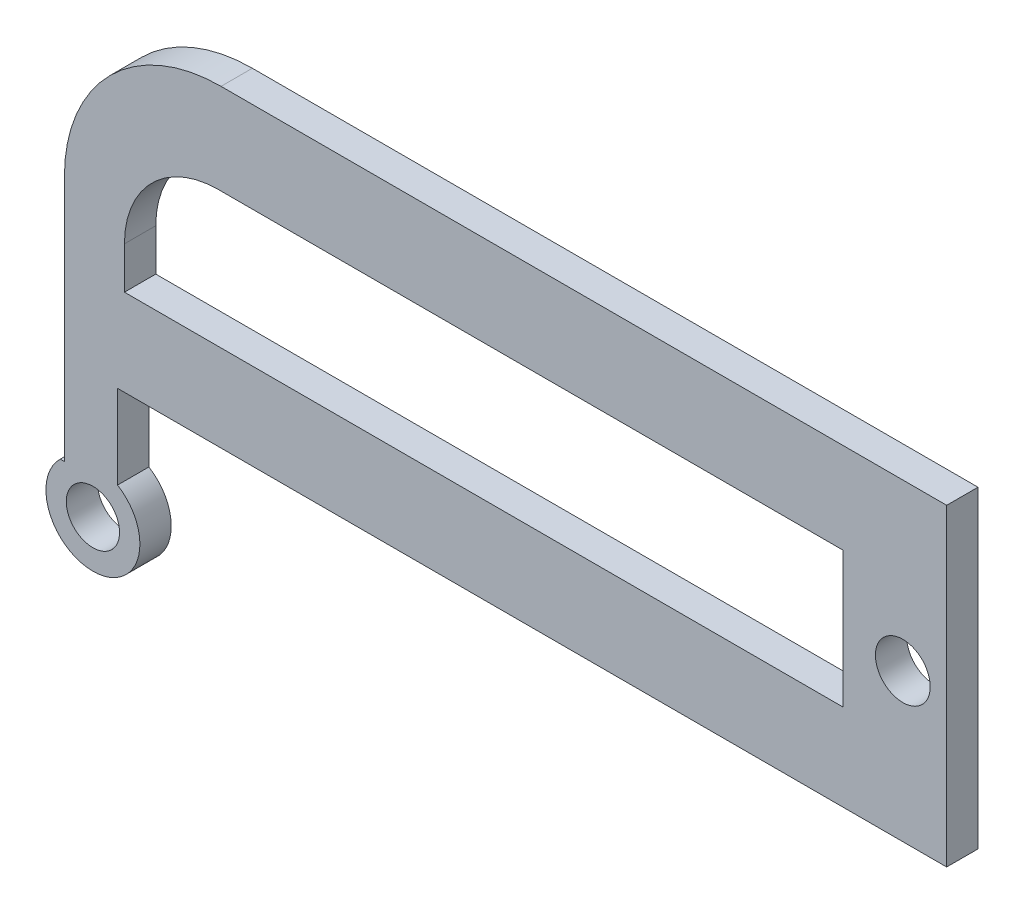
ISO-10303-21;
HEADER;
FILE_DESCRIPTION(('STEP AP214'),'2;1');
FILE_NAME('part.step','',(''),(''),'','','');
FILE_SCHEMA(('AUTOMOTIVE_DESIGN { 1 0 10303 214 1 1 1 1 }'));
ENDSEC;
DATA;
#1=APPLICATION_CONTEXT('core data for automotive mechanical design processes');
#2=APPLICATION_PROTOCOL_DEFINITION('international standard','automotive_design',2000,#1);
#3=PRODUCT_CONTEXT('',#1,'mechanical');
#4=PRODUCT('Part','Part','',(#3));
#5=PRODUCT_RELATED_PRODUCT_CATEGORY('part','',(#4));
#6=PRODUCT_DEFINITION_FORMATION('','',#4);
#7=PRODUCT_DEFINITION_CONTEXT('part definition',#1,'design');
#8=PRODUCT_DEFINITION('design','',#6,#7);
#9=PRODUCT_DEFINITION_SHAPE('','',#8);
#10=(LENGTH_UNIT() NAMED_UNIT(*) SI_UNIT(.MILLI.,.METRE.));
#11=(NAMED_UNIT(*) PLANE_ANGLE_UNIT() SI_UNIT($,.RADIAN.));
#12=(NAMED_UNIT(*) SI_UNIT($,.STERADIAN.) SOLID_ANGLE_UNIT());
#13=UNCERTAINTY_MEASURE_WITH_UNIT(LENGTH_MEASURE(1.E-05),#10,'distance_accuracy_value','');
#14=(GEOMETRIC_REPRESENTATION_CONTEXT(3) GLOBAL_UNCERTAINTY_ASSIGNED_CONTEXT((#13)) GLOBAL_UNIT_ASSIGNED_CONTEXT((#10,
#11,#12)) REPRESENTATION_CONTEXT('',''));
#15=CARTESIAN_POINT('',(0.,0.,0.));
#16=DIRECTION('',(0.,0.,1.));
#17=DIRECTION('',(1.,0.,0.));
#18=AXIS2_PLACEMENT_3D('',#15,#16,#17);
#19=CARTESIAN_POINT('',(0.,-12.4867305672765,2.));
#20=DIRECTION('',(0.,-1.,0.));
#21=DIRECTION('',(0.,0.,-1.));
#22=AXIS2_PLACEMENT_3D('',#19,#20,#21);
#23=PLANE('',#22);
#24=DIRECTION('',(-1.,0.,0.));
#25=VECTOR('',#24,1.);
#26=CARTESIAN_POINT('',(0.,-12.4867305672765,0.));
#27=LINE('',#26,#25);
#28=CARTESIAN_POINT('',(-27.6972768172026,-12.4867305672765,0.));
#29=VERTEX_POINT('',#28);
#30=CARTESIAN_POINT('',(-27.9606582372552,-12.4867305672765,0.));
#31=VERTEX_POINT('',#30);
#32=EDGE_CURVE('E195',#29,#31,#27,.T.);
#33=ORIENTED_EDGE('',*,*,#32,.T.);
#34=DIRECTION('',(0.,0.,-1.));
#35=VECTOR('',#34,1.);
#36=CARTESIAN_POINT('',(-27.9606582372552,-12.4867305672765,2.));
#37=LINE('',#36,#35);
#38=CARTESIAN_POINT('',(-27.9606582372552,-12.4867305672765,2.));
#39=VERTEX_POINT('',#38);
#40=EDGE_CURVE('E224',#39,#31,#37,.T.);
#41=ORIENTED_EDGE('',*,*,#40,.F.);
#42=DIRECTION('',(-1.,0.,0.));
#43=VECTOR('',#42,1.);
#44=CARTESIAN_POINT('',(0.,-12.4867305672765,2.));
#45=LINE('',#44,#43);
#46=CARTESIAN_POINT('',(-27.6972768172026,-12.4867305672765,2.));
#47=VERTEX_POINT('',#46);
#48=EDGE_CURVE('E172',#47,#39,#45,.T.);
#49=ORIENTED_EDGE('',*,*,#48,.F.);
#50=DIRECTION('',(0.,0.,-1.));
#51=VECTOR('',#50,1.);
#52=CARTESIAN_POINT('',(-27.6972768172026,-12.4867305672765,2.));
#53=LINE('',#52,#51);
#54=EDGE_CURVE('E189',#47,#29,#53,.T.);
#55=ORIENTED_EDGE('',*,*,#54,.T.);
#56=EDGE_LOOP('',(#33,#41,#49,#55));
#57=FACE_BOUND('',#56,.T.);
#58=ADVANCED_FACE('F35',(#57),#23,.F.);
#59=CARTESIAN_POINT('',(-25.8759774251106,-14.6440682579213,2.));
#60=DIRECTION('',(0.,0.,-1.));
#61=DIRECTION('',(-1.,0.,0.));
#62=AXIS2_PLACEMENT_3D('',#59,#60,#61);
#63=CYLINDRICAL_SURFACE('',#62,3.);
#64=CARTESIAN_POINT('',(-25.8759774251106,-14.6440682579213,0.));
#65=DIRECTION('',(0.,0.,1.));
#66=DIRECTION('',(1.,0.,0.));
#67=AXIS2_PLACEMENT_3D('',#64,#65,#66);
#68=CIRCLE('',#67,3.);
#69=CARTESIAN_POINT('',(-24.3013991517807,-12.0905014855111,0.));
#70=VERTEX_POINT('',#69);
#71=EDGE_CURVE('E198',#31,#70,#68,.T.);
#72=ORIENTED_EDGE('',*,*,#71,.T.);
#73=DIRECTION('',(0.,0.,-1.));
#74=VECTOR('',#73,1.);
#75=CARTESIAN_POINT('',(-24.3013991517807,-12.0905014855111,2.));
#76=LINE('',#75,#74);
#77=CARTESIAN_POINT('',(-24.3013991517807,-12.0905014855111,2.));
#78=VERTEX_POINT('',#77);
#79=EDGE_CURVE('E222',#78,#70,#76,.T.);
#80=ORIENTED_EDGE('',*,*,#79,.F.);
#81=CARTESIAN_POINT('',(-25.8759774251106,-14.6440682579213,2.));
#82=DIRECTION('',(0.,0.,1.));
#83=DIRECTION('',(1.,0.,0.));
#84=AXIS2_PLACEMENT_3D('',#81,#82,#83);
#85=CIRCLE('',#84,3.);
#86=EDGE_CURVE('E175',#39,#78,#85,.T.);
#87=ORIENTED_EDGE('',*,*,#86,.F.);
#88=ORIENTED_EDGE('',*,*,#40,.T.);
#89=EDGE_LOOP('',(#72,#80,#87,#88));
#90=FACE_BOUND('',#89,.T.);
#91=ADVANCED_FACE('F263',(#90),#63,.T.);
#92=CARTESIAN_POINT('',(-24.3013991517807,0.,2.));
#93=DIRECTION('',(1.,0.,0.));
#94=DIRECTION('',(0.,0.,-1.));
#95=AXIS2_PLACEMENT_3D('',#92,#93,#94);
#96=PLANE('',#95);
#97=DIRECTION('',(0.,-1.,0.));
#98=VECTOR('',#97,1.);
#99=CARTESIAN_POINT('',(-24.3013991517807,0.,0.));
#100=LINE('',#99,#98);
#101=CARTESIAN_POINT('',(-24.3013991517807,-6.74257553243988,0.));
#102=VERTEX_POINT('',#101);
#103=EDGE_CURVE('E201',#102,#70,#100,.T.);
#104=ORIENTED_EDGE('',*,*,#103,.F.);
#105=DIRECTION('',(0.,0.,-1.));
#106=VECTOR('',#105,1.);
#107=CARTESIAN_POINT('',(-24.3013991517807,-6.74257553243988,2.));
#108=LINE('',#107,#106);
#109=CARTESIAN_POINT('',(-24.3013991517807,-6.74257553243988,2.));
#110=VERTEX_POINT('',#109);
#111=EDGE_CURVE('E220',#110,#102,#108,.T.);
#112=ORIENTED_EDGE('',*,*,#111,.F.);
#113=DIRECTION('',(0.,-1.,0.));
#114=VECTOR('',#113,1.);
#115=CARTESIAN_POINT('',(-24.3013991517807,0.,2.));
#116=LINE('',#115,#114);
#117=EDGE_CURVE('E177',#110,#78,#116,.T.);
#118=ORIENTED_EDGE('',*,*,#117,.T.);
#119=ORIENTED_EDGE('',*,*,#79,.T.);
#120=EDGE_LOOP('',(#104,#112,#118,#119));
#121=FACE_BOUND('',#120,.T.);
#122=ADVANCED_FACE('F269',(#121),#96,.T.);
#123=CARTESIAN_POINT('',(0.,-6.74257553243988,2.));
#124=DIRECTION('',(0.,1.,0.));
#125=DIRECTION('',(0.,0.,1.));
#126=AXIS2_PLACEMENT_3D('',#123,#124,#125);
#127=PLANE('',#126);
#128=DIRECTION('',(1.,0.,0.));
#129=VECTOR('',#128,1.);
#130=CARTESIAN_POINT('',(0.,-6.74257553243988,0.));
#131=LINE('',#130,#129);
#132=CARTESIAN_POINT('',(28.6305684372034,-6.74257553243995,0.));
#133=VERTEX_POINT('',#132);
#134=EDGE_CURVE('E204',#102,#133,#131,.T.);
#135=ORIENTED_EDGE('',*,*,#134,.T.);
#136=DIRECTION('',(0.,0.,-1.));
#137=VECTOR('',#136,1.);
#138=CARTESIAN_POINT('',(28.6305684372034,-6.74257553243995,2.));
#139=LINE('',#138,#137);
#140=CARTESIAN_POINT('',(28.6305684372034,-6.74257553243995,2.));
#141=VERTEX_POINT('',#140);
#142=EDGE_CURVE('E217',#141,#133,#139,.T.);
#143=ORIENTED_EDGE('',*,*,#142,.F.);
#144=DIRECTION('',(1.,0.,0.));
#145=VECTOR('',#144,1.);
#146=CARTESIAN_POINT('',(0.,-6.74257553243988,2.));
#147=LINE('',#146,#145);
#148=EDGE_CURVE('E180',#110,#141,#147,.T.);
#149=ORIENTED_EDGE('',*,*,#148,.F.);
#150=ORIENTED_EDGE('',*,*,#111,.T.);
#151=EDGE_LOOP('',(#135,#143,#149,#150));
#152=FACE_BOUND('',#151,.T.);
#153=ADVANCED_FACE('F321',(#152),#127,.F.);
#154=CARTESIAN_POINT('',(28.6305684372034,0.,2.));
#155=DIRECTION('',(-1.,0.,0.));
#156=DIRECTION('',(0.,0.,1.));
#157=AXIS2_PLACEMENT_3D('',#154,#155,#156);
#158=PLANE('',#157);
#159=DIRECTION('',(0.,1.,0.));
#160=VECTOR('',#159,1.);
#161=CARTESIAN_POINT('',(28.6305684372034,0.,0.));
#162=LINE('',#161,#160);
#163=CARTESIAN_POINT('',(28.6305684372034,13.2574244675601,0.));
#164=VERTEX_POINT('',#163);
#165=EDGE_CURVE('E206',#133,#164,#162,.T.);
#166=ORIENTED_EDGE('',*,*,#165,.T.);
#167=DIRECTION('',(0.,0.,-1.));
#168=VECTOR('',#167,1.);
#169=CARTESIAN_POINT('',(28.6305684372034,13.2574244675601,2.));
#170=LINE('',#169,#168);
#171=CARTESIAN_POINT('',(28.6305684372034,13.2574244675601,2.));
#172=VERTEX_POINT('',#171);
#173=EDGE_CURVE('E214',#172,#164,#170,.T.);
#174=ORIENTED_EDGE('',*,*,#173,.F.);
#175=DIRECTION('',(0.,1.,0.));
#176=VECTOR('',#175,1.);
#177=CARTESIAN_POINT('',(28.6305684372034,0.,2.));
#178=LINE('',#177,#176);
#179=EDGE_CURVE('E182',#141,#172,#178,.T.);
#180=ORIENTED_EDGE('',*,*,#179,.F.);
#181=ORIENTED_EDGE('',*,*,#142,.T.);
#182=EDGE_LOOP('',(#166,#174,#180,#181));
#183=FACE_BOUND('',#182,.T.);
#184=ADVANCED_FACE('F315',(#183),#158,.F.);
#185=CARTESIAN_POINT('',(0.,13.2574244675601,2.));
#186=DIRECTION('',(0.,1.,0.));
#187=DIRECTION('',(0.,0.,1.));
#188=AXIS2_PLACEMENT_3D('',#185,#186,#187);
#189=PLANE('',#188);
#190=DIRECTION('',(1.,0.,0.));
#191=VECTOR('',#190,1.);
#192=CARTESIAN_POINT('',(0.,13.2574244675601,0.));
#193=LINE('',#192,#191);
#194=CARTESIAN_POINT('',(-17.6972768172026,13.2574244675601,0.));
#195=VERTEX_POINT('',#194);
#196=EDGE_CURVE('E209',#195,#164,#193,.T.);
#197=ORIENTED_EDGE('',*,*,#196,.F.);
#198=DIRECTION('',(0.,0.,-1.));
#199=VECTOR('',#198,1.);
#200=CARTESIAN_POINT('',(-17.6972768172026,13.2574244675601,2.));
#201=LINE('',#200,#199);
#202=CARTESIAN_POINT('',(-17.6972768172026,13.2574244675601,2.));
#203=VERTEX_POINT('',#202);
#204=EDGE_CURVE('E232',#195,#203,#201,.F.);
#205=ORIENTED_EDGE('',*,*,#204,.T.);
#206=DIRECTION('',(1.,0.,0.));
#207=VECTOR('',#206,1.);
#208=CARTESIAN_POINT('',(0.,13.2574244675601,2.));
#209=LINE('',#208,#207);
#210=EDGE_CURVE('E185',#203,#172,#209,.T.);
#211=ORIENTED_EDGE('',*,*,#210,.T.);
#212=ORIENTED_EDGE('',*,*,#173,.T.);
#213=EDGE_LOOP('',(#197,#205,#211,#212));
#214=FACE_BOUND('',#213,.T.);
#215=ADVANCED_FACE('F277',(#214),#189,.T.);
#216=CARTESIAN_POINT('',(-25.8759774251106,-14.6440682579213,2.));
#217=DIRECTION('',(0.,0.,-1.));
#218=DIRECTION('',(-1.,0.,0.));
#219=AXIS2_PLACEMENT_3D('',#216,#217,#218);
#220=CYLINDRICAL_SURFACE('',#219,1.7);
#221=CARTESIAN_POINT('',(-25.8759774251106,-14.6440682579213,2.));
#222=DIRECTION('',(0.,0.,1.));
#223=DIRECTION('',(1.,0.,0.));
#224=AXIS2_PLACEMENT_3D('',#221,#222,#223);
#225=CIRCLE('',#224,1.7);
#226=CARTESIAN_POINT('',(-24.1759774251106,-14.6440682579213,2.));
#227=VERTEX_POINT('',#226);
#228=EDGE_CURVE('E168',#227,#227,#225,.T.);
#229=ORIENTED_EDGE('',*,*,#228,.T.);
#230=EDGE_LOOP('',(#229));
#231=FACE_BOUND('',#230,.T.);
#232=CARTESIAN_POINT('',(-25.8759774251106,-14.6440682579213,0.));
#233=DIRECTION('',(0.,0.,1.));
#234=DIRECTION('',(1.,0.,0.));
#235=AXIS2_PLACEMENT_3D('',#232,#233,#234);
#236=CIRCLE('',#235,1.7);
#237=CARTESIAN_POINT('',(-24.1759774251106,-14.6440682579213,0.));
#238=VERTEX_POINT('',#237);
#239=EDGE_CURVE('E192',#238,#238,#236,.T.);
#240=ORIENTED_EDGE('',*,*,#239,.F.);
#241=EDGE_LOOP('',(#240));
#242=FACE_BOUND('',#241,.T.);
#243=ADVANCED_FACE('F274',(#231,#242),#220,.F.);
#244=CARTESIAN_POINT('',(25.8307602946802,2.70027197163987,2.));
#245=DIRECTION('',(0.,0.,-1.));
#246=DIRECTION('',(-1.,0.,0.));
#247=AXIS2_PLACEMENT_3D('',#244,#245,#246);
#248=CYLINDRICAL_SURFACE('',#247,1.75);
#249=CARTESIAN_POINT('',(25.8307602946802,2.70027197163987,2.));
#250=DIRECTION('',(0.,0.,1.));
#251=DIRECTION('',(1.,0.,0.));
#252=AXIS2_PLACEMENT_3D('',#249,#250,#251);
#253=CIRCLE('',#252,1.75);
#254=CARTESIAN_POINT('',(27.5807602946802,2.70027197163987,2.));
#255=VERTEX_POINT('',#254);
#256=EDGE_CURVE('E165',#255,#255,#253,.T.);
#257=ORIENTED_EDGE('',*,*,#256,.T.);
#258=EDGE_LOOP('',(#257));
#259=FACE_BOUND('',#258,.T.);
#260=CARTESIAN_POINT('',(25.8307602946802,2.70027197163987,0.));
#261=DIRECTION('',(0.,0.,1.));
#262=DIRECTION('',(1.,0.,0.));
#263=AXIS2_PLACEMENT_3D('',#260,#261,#262);
#264=CIRCLE('',#263,1.75);
#265=CARTESIAN_POINT('',(27.5807602946802,2.70027197163987,0.));
#266=VERTEX_POINT('',#265);
#267=EDGE_CURVE('E160',#266,#266,#264,.T.);
#268=ORIENTED_EDGE('',*,*,#267,.F.);
#269=EDGE_LOOP('',(#268));
#270=FACE_BOUND('',#269,.T.);
#271=ADVANCED_FACE('F276',(#259,#270),#248,.F.);
#272=CARTESIAN_POINT('',(-27.6972768172026,0.,2.));
#273=DIRECTION('',(1.,0.,0.));
#274=DIRECTION('',(0.,1.,0.));
#275=AXIS2_PLACEMENT_3D('',#272,#273,#274);
#276=PLANE('',#275);
#277=DIRECTION('',(0.,-1.,0.));
#278=VECTOR('',#277,1.);
#279=CARTESIAN_POINT('',(-27.6972768172026,0.,2.));
#280=LINE('',#279,#278);
#281=CARTESIAN_POINT('',(-27.6972768172026,3.25742446756005,2.));
#282=VERTEX_POINT('',#281);
#283=EDGE_CURVE('E187',#282,#47,#280,.T.);
#284=ORIENTED_EDGE('',*,*,#283,.F.);
#285=DIRECTION('',(0.,0.,-1.));
#286=VECTOR('',#285,1.);
#287=CARTESIAN_POINT('',(-27.6972768172026,3.25742446756005,0.));
#288=LINE('',#287,#286);
#289=CARTESIAN_POINT('',(-27.6972768172026,3.25742446756005,0.));
#290=VERTEX_POINT('',#289);
#291=EDGE_CURVE('E227',#282,#290,#288,.T.);
#292=ORIENTED_EDGE('',*,*,#291,.T.);
#293=DIRECTION('',(0.,-1.,0.));
#294=VECTOR('',#293,1.);
#295=CARTESIAN_POINT('',(-27.6972768172026,0.,0.));
#296=LINE('',#295,#294);
#297=EDGE_CURVE('E169',#290,#29,#296,.T.);
#298=ORIENTED_EDGE('',*,*,#297,.T.);
#299=ORIENTED_EDGE('',*,*,#54,.F.);
#300=EDGE_LOOP('',(#284,#292,#298,#299));
#301=FACE_BOUND('',#300,.T.);
#302=ADVANCED_FACE('F280',(#301),#276,.F.);
#303=CARTESIAN_POINT('',(0.,0.,2.));
#304=DIRECTION('',(0.,0.,1.));
#305=DIRECTION('',(1.,0.,0.));
#306=AXIS2_PLACEMENT_3D('',#303,#304,#305);
#307=PLANE('',#306);
#308=DIRECTION('',(0.,1.,0.));
#309=VECTOR('',#308,1.);
#310=CARTESIAN_POINT('',(22.0053386968096,-1.2065872238054,2.));
#311=LINE('',#310,#309);
#312=CARTESIAN_POINT('',(22.0053386968096,-1.2065872238054,2.));
#313=VERTEX_POINT('',#312);
#314=CARTESIAN_POINT('',(22.0053386968096,7.46754421550122,2.));
#315=VERTEX_POINT('',#314);
#316=EDGE_CURVE('E50',#313,#315,#311,.T.);
#317=ORIENTED_EDGE('',*,*,#316,.F.);
#318=DIRECTION('',(1.,0.,0.));
#319=VECTOR('',#318,1.);
#320=CARTESIAN_POINT('',(-23.8630335737238,-1.2065872238054,2.));
#321=LINE('',#320,#319);
#322=CARTESIAN_POINT('',(-23.8630335737238,-1.2065872238054,2.));
#323=VERTEX_POINT('',#322);
#324=EDGE_CURVE('E152',#323,#313,#321,.T.);
#325=ORIENTED_EDGE('',*,*,#324,.F.);
#326=DIRECTION('',(0.,-1.,0.));
#327=VECTOR('',#326,1.);
#328=CARTESIAN_POINT('',(-23.8630335737238,-1.2065872238054,2.));
#329=LINE('',#328,#327);
#330=CARTESIAN_POINT('',(-23.8630335737238,1.46754421550122,2.));
#331=VERTEX_POINT('',#330);
#332=EDGE_CURVE('E150',#331,#323,#329,.T.);
#333=ORIENTED_EDGE('',*,*,#332,.F.);
#334=CARTESIAN_POINT('',(-17.8630335737238,1.46754421550122,2.));
#335=DIRECTION('',(0.,0.,1.));
#336=DIRECTION('',(-1.,0.,0.));
#337=AXIS2_PLACEMENT_3D('',#334,#335,#336);
#338=CIRCLE('',#337,6.);
#339=CARTESIAN_POINT('',(-17.8630335737238,7.46754421550122,2.));
#340=VERTEX_POINT('',#339);
#341=EDGE_CURVE('E133',#340,#331,#338,.T.);
#342=ORIENTED_EDGE('',*,*,#341,.F.);
#343=DIRECTION('',(-1.,0.,0.));
#344=VECTOR('',#343,1.);
#345=CARTESIAN_POINT('',(-17.8630335737238,7.46754421550122,2.));
#346=LINE('',#345,#344);
#347=EDGE_CURVE('E142',#315,#340,#346,.T.);
#348=ORIENTED_EDGE('',*,*,#347,.F.);
#349=EDGE_LOOP('',(#317,#325,#333,#342,#348));
#350=FACE_BOUND('',#349,.T.);
#351=ORIENTED_EDGE('',*,*,#256,.F.);
#352=EDGE_LOOP('',(#351));
#353=FACE_BOUND('',#352,.T.);
#354=ORIENTED_EDGE('',*,*,#228,.F.);
#355=EDGE_LOOP('',(#354));
#356=FACE_BOUND('',#355,.T.);
#357=ORIENTED_EDGE('',*,*,#210,.F.);
#358=CARTESIAN_POINT('',(-17.6972768172026,3.25742446756005,2.));
#359=DIRECTION('',(0.,0.,1.));
#360=DIRECTION('',(1.,0.,0.));
#361=AXIS2_PLACEMENT_3D('',#358,#359,#360);
#362=CIRCLE('',#361,10.);
#363=EDGE_CURVE('E234',#203,#282,#362,.T.);
#364=ORIENTED_EDGE('',*,*,#363,.T.);
#365=ORIENTED_EDGE('',*,*,#283,.T.);
#366=ORIENTED_EDGE('',*,*,#48,.T.);
#367=ORIENTED_EDGE('',*,*,#86,.T.);
#368=ORIENTED_EDGE('',*,*,#117,.F.);
#369=ORIENTED_EDGE('',*,*,#148,.T.);
#370=ORIENTED_EDGE('',*,*,#179,.T.);
#371=EDGE_LOOP('',(#357,#364,#365,#366,#367,#368,#369,#370));
#372=FACE_BOUND('',#371,.T.);
#373=ADVANCED_FACE('F146',(#350,#353,#356,#372),#307,.T.);
#374=CARTESIAN_POINT('',(0.,0.,0.));
#375=DIRECTION('',(0.,0.,1.));
#376=DIRECTION('',(1.,0.,0.));
#377=AXIS2_PLACEMENT_3D('',#374,#375,#376);
#378=PLANE('',#377);
#379=DIRECTION('',(1.,0.,0.));
#380=VECTOR('',#379,1.);
#381=CARTESIAN_POINT('',(0.,-1.2065872238054,0.));
#382=LINE('',#381,#380);
#383=CARTESIAN_POINT('',(-23.8630335737238,-1.2065872238054,0.));
#384=VERTEX_POINT('',#383);
#385=CARTESIAN_POINT('',(22.0053386968096,-1.2065872238054,0.));
#386=VERTEX_POINT('',#385);
#387=EDGE_CURVE('E43',#384,#386,#382,.T.);
#388=ORIENTED_EDGE('',*,*,#387,.T.);
#389=DIRECTION('',(0.,1.,0.));
#390=VECTOR('',#389,1.);
#391=CARTESIAN_POINT('',(22.0053386968096,0.,0.));
#392=LINE('',#391,#390);
#393=CARTESIAN_POINT('',(22.0053386968096,7.46754421550122,0.));
#394=VERTEX_POINT('',#393);
#395=EDGE_CURVE('E11',#386,#394,#392,.T.);
#396=ORIENTED_EDGE('',*,*,#395,.T.);
#397=DIRECTION('',(-1.,0.,0.));
#398=VECTOR('',#397,1.);
#399=CARTESIAN_POINT('',(0.,7.46754421550122,0.));
#400=LINE('',#399,#398);
#401=CARTESIAN_POINT('',(-17.8630335737238,7.46754421550122,0.));
#402=VERTEX_POINT('',#401);
#403=EDGE_CURVE('E236',#394,#402,#400,.T.);
#404=ORIENTED_EDGE('',*,*,#403,.T.);
#405=CARTESIAN_POINT('',(-17.8630335737238,1.46754421550122,0.));
#406=DIRECTION('',(0.,0.,1.));
#407=DIRECTION('',(1.,0.,0.));
#408=AXIS2_PLACEMENT_3D('',#405,#406,#407);
#409=CIRCLE('',#408,6.);
#410=CARTESIAN_POINT('',(-23.8630335737238,1.46754421550122,0.));
#411=VERTEX_POINT('',#410);
#412=EDGE_CURVE('E136',#402,#411,#409,.T.);
#413=ORIENTED_EDGE('',*,*,#412,.T.);
#414=DIRECTION('',(0.,-1.,0.));
#415=VECTOR('',#414,1.);
#416=CARTESIAN_POINT('',(-23.8630335737238,0.,0.));
#417=LINE('',#416,#415);
#418=EDGE_CURVE('E239',#411,#384,#417,.T.);
#419=ORIENTED_EDGE('',*,*,#418,.T.);
#420=EDGE_LOOP('',(#388,#396,#404,#413,#419));
#421=FACE_BOUND('',#420,.T.);
#422=ORIENTED_EDGE('',*,*,#267,.T.);
#423=EDGE_LOOP('',(#422));
#424=FACE_BOUND('',#423,.T.);
#425=ORIENTED_EDGE('',*,*,#239,.T.);
#426=EDGE_LOOP('',(#425));
#427=FACE_BOUND('',#426,.T.);
#428=ORIENTED_EDGE('',*,*,#297,.F.);
#429=CARTESIAN_POINT('',(-17.6972768172026,3.25742446756005,0.));
#430=DIRECTION('',(0.,0.,1.));
#431=DIRECTION('',(1.,0.,0.));
#432=AXIS2_PLACEMENT_3D('',#429,#430,#431);
#433=CIRCLE('',#432,10.);
#434=EDGE_CURVE('E230',#290,#195,#433,.F.);
#435=ORIENTED_EDGE('',*,*,#434,.T.);
#436=ORIENTED_EDGE('',*,*,#196,.T.);
#437=ORIENTED_EDGE('',*,*,#165,.F.);
#438=ORIENTED_EDGE('',*,*,#134,.F.);
#439=ORIENTED_EDGE('',*,*,#103,.T.);
#440=ORIENTED_EDGE('',*,*,#71,.F.);
#441=ORIENTED_EDGE('',*,*,#32,.F.);
#442=EDGE_LOOP('',(#428,#435,#436,#437,#438,#439,#440,#441));
#443=FACE_BOUND('',#442,.T.);
#444=ADVANCED_FACE('F243',(#421,#424,#427,#443),#378,.F.);
#445=CARTESIAN_POINT('',(-17.6972768172026,3.25742446756005,2.));
#446=DIRECTION('',(0.,0.,1.));
#447=DIRECTION('',(1.,0.,0.));
#448=AXIS2_PLACEMENT_3D('',#445,#446,#447);
#449=CYLINDRICAL_SURFACE('',#448,10.);
#450=ORIENTED_EDGE('',*,*,#363,.F.);
#451=ORIENTED_EDGE('',*,*,#204,.F.);
#452=ORIENTED_EDGE('',*,*,#434,.F.);
#453=ORIENTED_EDGE('',*,*,#291,.F.);
#454=EDGE_LOOP('',(#450,#451,#452,#453));
#455=FACE_BOUND('',#454,.T.);
#456=ADVANCED_FACE('F37',(#455),#449,.T.);
#457=CARTESIAN_POINT('',(22.0053386968096,-1.2065872238054,-2.3));
#458=DIRECTION('',(1.,0.,0.));
#459=DIRECTION('',(0.,1.,0.));
#460=AXIS2_PLACEMENT_3D('',#457,#458,#459);
#461=PLANE('',#460);
#462=DIRECTION('',(0.,0.,1.));
#463=VECTOR('',#462,1.);
#464=CARTESIAN_POINT('',(22.0053386968096,-1.2065872238054,-2.3));
#465=LINE('',#464,#463);
#466=EDGE_CURVE('E158',#386,#313,#465,.T.);
#467=ORIENTED_EDGE('',*,*,#466,.T.);
#468=ORIENTED_EDGE('',*,*,#316,.T.);
#469=DIRECTION('',(0.,0.,1.));
#470=VECTOR('',#469,1.);
#471=CARTESIAN_POINT('',(22.0053386968096,7.46754421550122,-2.3));
#472=LINE('',#471,#470);
#473=EDGE_CURVE('E139',#394,#315,#472,.T.);
#474=ORIENTED_EDGE('',*,*,#473,.F.);
#475=ORIENTED_EDGE('',*,*,#395,.F.);
#476=EDGE_LOOP('',(#467,#468,#474,#475));
#477=FACE_BOUND('',#476,.T.);
#478=ADVANCED_FACE('F251',(#477),#461,.F.);
#479=CARTESIAN_POINT('',(-23.8630335737238,-1.2065872238054,-2.3));
#480=DIRECTION('',(0.,-1.,0.));
#481=DIRECTION('',(0.,0.,-1.));
#482=AXIS2_PLACEMENT_3D('',#479,#480,#481);
#483=PLANE('',#482);
#484=DIRECTION('',(0.,0.,1.));
#485=VECTOR('',#484,1.);
#486=CARTESIAN_POINT('',(-23.8630335737238,-1.2065872238054,-2.3));
#487=LINE('',#486,#485);
#488=EDGE_CURVE('E161',#384,#323,#487,.T.);
#489=ORIENTED_EDGE('',*,*,#488,.T.);
#490=ORIENTED_EDGE('',*,*,#324,.T.);
#491=ORIENTED_EDGE('',*,*,#466,.F.);
#492=ORIENTED_EDGE('',*,*,#387,.F.);
#493=EDGE_LOOP('',(#489,#490,#491,#492));
#494=FACE_BOUND('',#493,.T.);
#495=ADVANCED_FACE('F248',(#494),#483,.F.);
#496=CARTESIAN_POINT('',(-23.8630335737238,-1.2065872238054,-2.3));
#497=DIRECTION('',(-1.,0.,0.));
#498=DIRECTION('',(0.,0.,1.));
#499=AXIS2_PLACEMENT_3D('',#496,#497,#498);
#500=PLANE('',#499);
#501=DIRECTION('',(0.,0.,1.));
#502=VECTOR('',#501,1.);
#503=CARTESIAN_POINT('',(-23.8630335737238,1.46754421550122,-2.3));
#504=LINE('',#503,#502);
#505=EDGE_CURVE('E138',#411,#331,#504,.T.);
#506=ORIENTED_EDGE('',*,*,#505,.T.);
#507=ORIENTED_EDGE('',*,*,#332,.T.);
#508=ORIENTED_EDGE('',*,*,#488,.F.);
#509=ORIENTED_EDGE('',*,*,#418,.F.);
#510=EDGE_LOOP('',(#506,#507,#508,#509));
#511=FACE_BOUND('',#510,.T.);
#512=ADVANCED_FACE('F250',(#511),#500,.F.);
#513=CARTESIAN_POINT('',(-17.8630335737238,1.46754421550122,-2.3));
#514=DIRECTION('',(0.,0.,1.));
#515=DIRECTION('',(1.,0.,0.));
#516=AXIS2_PLACEMENT_3D('',#513,#514,#515);
#517=CYLINDRICAL_SURFACE('',#516,6.);
#518=DIRECTION('',(0.,0.,1.));
#519=VECTOR('',#518,1.);
#520=CARTESIAN_POINT('',(-17.8630335737238,7.46754421550122,-2.3));
#521=LINE('',#520,#519);
#522=EDGE_CURVE('E58',#402,#340,#521,.T.);
#523=ORIENTED_EDGE('',*,*,#522,.T.);
#524=ORIENTED_EDGE('',*,*,#341,.T.);
#525=ORIENTED_EDGE('',*,*,#505,.F.);
#526=ORIENTED_EDGE('',*,*,#412,.F.);
#527=EDGE_LOOP('',(#523,#524,#525,#526));
#528=FACE_BOUND('',#527,.T.);
#529=ADVANCED_FACE('F130',(#528),#517,.F.);
#530=CARTESIAN_POINT('',(-17.8630335737238,7.46754421550122,-2.3));
#531=DIRECTION('',(0.,1.,0.));
#532=DIRECTION('',(0.,0.,1.));
#533=AXIS2_PLACEMENT_3D('',#530,#531,#532);
#534=PLANE('',#533);
#535=ORIENTED_EDGE('',*,*,#473,.T.);
#536=ORIENTED_EDGE('',*,*,#347,.T.);
#537=ORIENTED_EDGE('',*,*,#522,.F.);
#538=ORIENTED_EDGE('',*,*,#403,.F.);
#539=EDGE_LOOP('',(#535,#536,#537,#538));
#540=FACE_BOUND('',#539,.T.);
#541=ADVANCED_FACE('F143',(#540),#534,.F.);
#542=CLOSED_SHELL('',(#58,#91,#122,#153,#184,#215,#243,#271,#302,#373,#444,#456,#478,#495,#512,
#529,#541));
#543=MANIFOLD_SOLID_BREP('B2',#542);
#544=ADVANCED_BREP_SHAPE_REPRESENTATION('',(#18,#543),#14);
#545=SHAPE_DEFINITION_REPRESENTATION(#9,#544);
ENDSEC;
END-ISO-10303-21;
